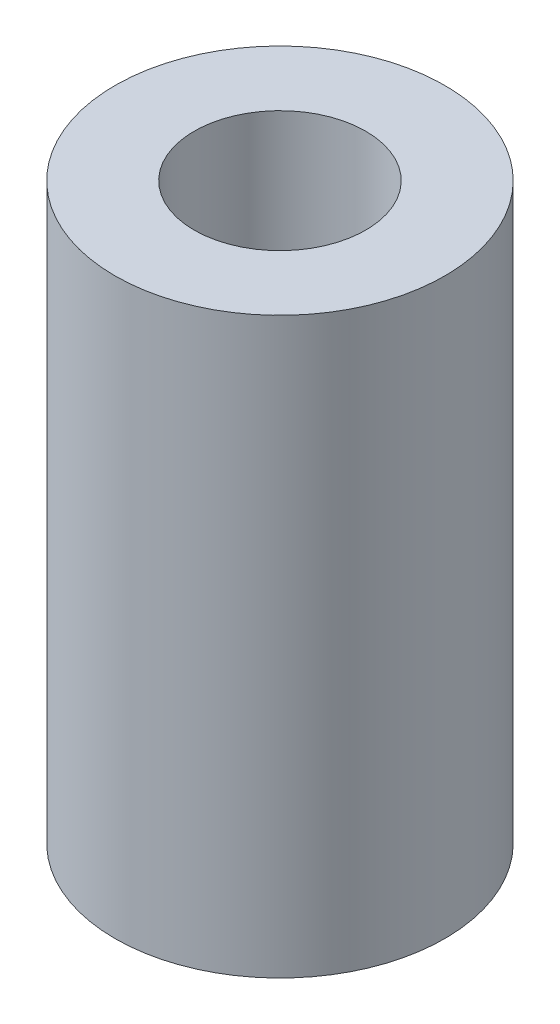
ISO-10303-21;
HEADER;
FILE_DESCRIPTION(('STEP AP214'),'2;1');
FILE_NAME('part.step','',(''),(''),'','','');
FILE_SCHEMA(('AUTOMOTIVE_DESIGN { 1 0 10303 214 1 1 1 1 }'));
ENDSEC;
DATA;
#1=APPLICATION_CONTEXT('core data for automotive mechanical design processes');
#2=APPLICATION_PROTOCOL_DEFINITION('international standard','automotive_design',2000,#1);
#3=PRODUCT_CONTEXT('',#1,'mechanical');
#4=PRODUCT('Part','Part','',(#3));
#5=PRODUCT_RELATED_PRODUCT_CATEGORY('part','',(#4));
#6=PRODUCT_DEFINITION_FORMATION('','',#4);
#7=PRODUCT_DEFINITION_CONTEXT('part definition',#1,'design');
#8=PRODUCT_DEFINITION('design','',#6,#7);
#9=PRODUCT_DEFINITION_SHAPE('','',#8);
#10=(LENGTH_UNIT() NAMED_UNIT(*) SI_UNIT(.MILLI.,.METRE.));
#11=(NAMED_UNIT(*) PLANE_ANGLE_UNIT() SI_UNIT($,.RADIAN.));
#12=(NAMED_UNIT(*) SI_UNIT($,.STERADIAN.) SOLID_ANGLE_UNIT());
#13=UNCERTAINTY_MEASURE_WITH_UNIT(LENGTH_MEASURE(1.E-05),#10,'distance_accuracy_value','');
#14=(GEOMETRIC_REPRESENTATION_CONTEXT(3) GLOBAL_UNCERTAINTY_ASSIGNED_CONTEXT((#13)) GLOBAL_UNIT_ASSIGNED_CONTEXT((#10,
#11,#12)) REPRESENTATION_CONTEXT('',''));
#15=CARTESIAN_POINT('',(0.,0.,0.));
#16=DIRECTION('',(0.,0.,1.));
#17=DIRECTION('',(1.,0.,0.));
#18=AXIS2_PLACEMENT_3D('',#15,#16,#17);
#19=CARTESIAN_POINT('',(0.,11.049,0.));
#20=DIRECTION('',(0.,1.,0.));
#21=DIRECTION('',(0.,0.,1.));
#22=AXIS2_PLACEMENT_3D('',#19,#20,#21);
#23=PLANE('',#22);
#24=CARTESIAN_POINT('',(0.,11.049,0.));
#25=DIRECTION('',(0.,1.,0.));
#26=DIRECTION('',(0.,0.,1.));
#27=AXIS2_PLACEMENT_3D('',#24,#25,#26);
#28=CIRCLE('',#27,3.175);
#29=CARTESIAN_POINT('',(0.,11.049,3.175));
#30=VERTEX_POINT('',#29);
#31=EDGE_CURVE('E10',#30,#30,#28,.T.);
#32=ORIENTED_EDGE('',*,*,#31,.T.);
#33=EDGE_LOOP('',(#32));
#34=FACE_BOUND('',#33,.T.);
#35=CARTESIAN_POINT('',(0.,11.049,0.));
#36=DIRECTION('',(0.,1.,0.));
#37=DIRECTION('',(0.,0.,1.));
#38=AXIS2_PLACEMENT_3D('',#35,#36,#37);
#39=CIRCLE('',#38,1.651);
#40=CARTESIAN_POINT('',(0.,11.049,1.651));
#41=VERTEX_POINT('',#40);
#42=EDGE_CURVE('E48',#41,#41,#39,.T.);
#43=ORIENTED_EDGE('',*,*,#42,.F.);
#44=EDGE_LOOP('',(#43));
#45=FACE_BOUND('',#44,.T.);
#46=ADVANCED_FACE('F37',(#34,#45),#23,.T.);
#47=CARTESIAN_POINT('',(0.,0.,0.));
#48=DIRECTION('',(0.,1.,0.));
#49=DIRECTION('',(0.,0.,1.));
#50=AXIS2_PLACEMENT_3D('',#47,#48,#49);
#51=PLANE('',#50);
#52=CARTESIAN_POINT('',(0.,0.,0.));
#53=DIRECTION('',(0.,1.,0.));
#54=DIRECTION('',(0.,0.,1.));
#55=AXIS2_PLACEMENT_3D('',#52,#53,#54);
#56=CIRCLE('',#55,3.175);
#57=CARTESIAN_POINT('',(0.,0.,3.175));
#58=VERTEX_POINT('',#57);
#59=EDGE_CURVE('E41',#58,#58,#56,.T.);
#60=ORIENTED_EDGE('',*,*,#59,.F.);
#61=EDGE_LOOP('',(#60));
#62=FACE_BOUND('',#61,.T.);
#63=CARTESIAN_POINT('',(0.,0.,0.));
#64=DIRECTION('',(0.,1.,0.));
#65=DIRECTION('',(0.,0.,1.));
#66=AXIS2_PLACEMENT_3D('',#63,#64,#65);
#67=CIRCLE('',#66,1.651);
#68=CARTESIAN_POINT('',(0.,0.,1.651));
#69=VERTEX_POINT('',#68);
#70=EDGE_CURVE('E50',#69,#69,#67,.T.);
#71=ORIENTED_EDGE('',*,*,#70,.T.);
#72=EDGE_LOOP('',(#71));
#73=FACE_BOUND('',#72,.T.);
#74=ADVANCED_FACE('F60',(#62,#73),#51,.F.);
#75=CARTESIAN_POINT('',(0.,11.049,0.));
#76=DIRECTION('',(0.,-1.,0.));
#77=DIRECTION('',(0.,0.,-1.));
#78=AXIS2_PLACEMENT_3D('',#75,#76,#77);
#79=CYLINDRICAL_SURFACE('',#78,3.175);
#80=ORIENTED_EDGE('',*,*,#31,.F.);
#81=EDGE_LOOP('',(#80));
#82=FACE_BOUND('',#81,.T.);
#83=ORIENTED_EDGE('',*,*,#59,.T.);
#84=EDGE_LOOP('',(#83));
#85=FACE_BOUND('',#84,.T.);
#86=ADVANCED_FACE('F39',(#82,#85),#79,.T.);
#87=CARTESIAN_POINT('',(0.,11.049,0.));
#88=DIRECTION('',(0.,-1.,0.));
#89=DIRECTION('',(0.,0.,-1.));
#90=AXIS2_PLACEMENT_3D('',#87,#88,#89);
#91=CYLINDRICAL_SURFACE('',#90,1.651);
#92=ORIENTED_EDGE('',*,*,#42,.T.);
#93=EDGE_LOOP('',(#92));
#94=FACE_BOUND('',#93,.T.);
#95=ORIENTED_EDGE('',*,*,#70,.F.);
#96=EDGE_LOOP('',(#95));
#97=FACE_BOUND('',#96,.T.);
#98=ADVANCED_FACE('F56',(#94,#97),#91,.F.);
#99=CLOSED_SHELL('',(#46,#74,#86,#98));
#100=MANIFOLD_SOLID_BREP('B2',#99);
#101=ADVANCED_BREP_SHAPE_REPRESENTATION('',(#18,#100),#14);
#102=SHAPE_DEFINITION_REPRESENTATION(#9,#101);
ENDSEC;
END-ISO-10303-21;
